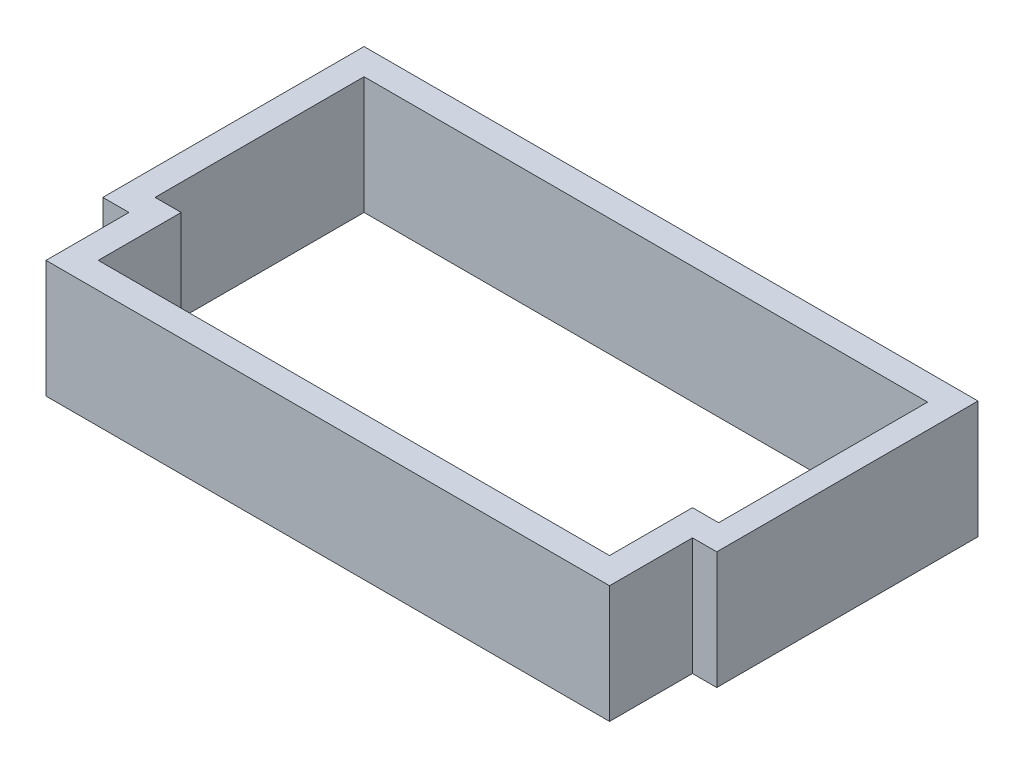
ISO-10303-21;
HEADER;
FILE_DESCRIPTION(('STEP AP214'),'2;1');
FILE_NAME('part.step','',(''),(''),'','','');
FILE_SCHEMA(('AUTOMOTIVE_DESIGN { 1 0 10303 214 1 1 1 1 }'));
ENDSEC;
DATA;
#1=APPLICATION_CONTEXT('core data for automotive mechanical design processes');
#2=APPLICATION_PROTOCOL_DEFINITION('international standard','automotive_design',2000,#1);
#3=PRODUCT_CONTEXT('',#1,'mechanical');
#4=PRODUCT('Part','Part','',(#3));
#5=PRODUCT_RELATED_PRODUCT_CATEGORY('part','',(#4));
#6=PRODUCT_DEFINITION_FORMATION('','',#4);
#7=PRODUCT_DEFINITION_CONTEXT('part definition',#1,'design');
#8=PRODUCT_DEFINITION('design','',#6,#7);
#9=PRODUCT_DEFINITION_SHAPE('','',#8);
#10=(LENGTH_UNIT() NAMED_UNIT(*) SI_UNIT(.MILLI.,.METRE.));
#11=(NAMED_UNIT(*) PLANE_ANGLE_UNIT() SI_UNIT($,.RADIAN.));
#12=(NAMED_UNIT(*) SI_UNIT($,.STERADIAN.) SOLID_ANGLE_UNIT());
#13=UNCERTAINTY_MEASURE_WITH_UNIT(LENGTH_MEASURE(1.E-05),#10,'distance_accuracy_value','');
#14=(GEOMETRIC_REPRESENTATION_CONTEXT(3) GLOBAL_UNCERTAINTY_ASSIGNED_CONTEXT((#13)) GLOBAL_UNIT_ASSIGNED_CONTEXT((#10,
#11,#12)) REPRESENTATION_CONTEXT('',''));
#15=CARTESIAN_POINT('',(0.,0.,0.));
#16=DIRECTION('',(0.,0.,1.));
#17=DIRECTION('',(1.,0.,0.));
#18=AXIS2_PLACEMENT_3D('',#15,#16,#17);
#19=CARTESIAN_POINT('',(0.,4.5,0.));
#20=DIRECTION('',(0.,1.,0.));
#21=DIRECTION('',(0.,0.,1.));
#22=AXIS2_PLACEMENT_3D('',#19,#20,#21);
#23=PLANE('',#22);
#24=DIRECTION('',(-1.,0.,0.));
#25=VECTOR('',#24,1.);
#26=CARTESIAN_POINT('',(11.7144102980499,4.5,-5.));
#27=LINE('',#26,#25);
#28=CARTESIAN_POINT('',(11.7144102980499,4.5,-5.));
#29=VERTEX_POINT('',#28);
#30=CARTESIAN_POINT('',(-11.7855897019501,4.5,-5.));
#31=VERTEX_POINT('',#30);
#32=EDGE_CURVE('E212',#29,#31,#27,.T.);
#33=ORIENTED_EDGE('',*,*,#32,.T.);
#34=DIRECTION('',(0.,0.,1.));
#35=VECTOR('',#34,1.);
#36=CARTESIAN_POINT('',(-11.7855897019501,4.5,-5.));
#37=LINE('',#36,#35);
#38=CARTESIAN_POINT('',(-11.7855897019501,4.5,5.));
#39=VERTEX_POINT('',#38);
#40=EDGE_CURVE('E215',#31,#39,#37,.T.);
#41=ORIENTED_EDGE('',*,*,#40,.T.);
#42=DIRECTION('',(1.,0.,0.));
#43=VECTOR('',#42,1.);
#44=CARTESIAN_POINT('',(-11.7855897019501,4.5,5.));
#45=LINE('',#44,#43);
#46=CARTESIAN_POINT('',(-10.78558970195,4.5,5.));
#47=VERTEX_POINT('',#46);
#48=EDGE_CURVE('E218',#39,#47,#45,.T.);
#49=ORIENTED_EDGE('',*,*,#48,.T.);
#50=DIRECTION('',(0.,0.,1.));
#51=VECTOR('',#50,1.);
#52=CARTESIAN_POINT('',(-10.78558970195,4.5,5.));
#53=LINE('',#52,#51);
#54=CARTESIAN_POINT('',(-10.78558970195,4.5,8.175));
#55=VERTEX_POINT('',#54);
#56=EDGE_CURVE('E220',#47,#55,#53,.T.);
#57=ORIENTED_EDGE('',*,*,#56,.T.);
#58=DIRECTION('',(1.,0.,0.));
#59=VECTOR('',#58,1.);
#60=CARTESIAN_POINT('',(-10.78558970195,4.5,8.175));
#61=LINE('',#60,#59);
#62=CARTESIAN_POINT('',(10.7855897019503,4.5,8.175));
#63=VERTEX_POINT('',#62);
#64=EDGE_CURVE('E222',#55,#63,#61,.T.);
#65=ORIENTED_EDGE('',*,*,#64,.T.);
#66=DIRECTION('',(0.,0.,-1.));
#67=VECTOR('',#66,1.);
#68=CARTESIAN_POINT('',(10.7855897019503,4.5,8.175));
#69=LINE('',#68,#67);
#70=CARTESIAN_POINT('',(10.7855897019503,4.5,5.));
#71=VERTEX_POINT('',#70);
#72=EDGE_CURVE('E224',#63,#71,#69,.T.);
#73=ORIENTED_EDGE('',*,*,#72,.T.);
#74=DIRECTION('',(1.,0.,0.));
#75=VECTOR('',#74,1.);
#76=CARTESIAN_POINT('',(11.7144102980499,4.5,5.));
#77=LINE('',#76,#75);
#78=CARTESIAN_POINT('',(11.7144102980499,4.5,5.));
#79=VERTEX_POINT('',#78);
#80=EDGE_CURVE('E226',#71,#79,#77,.T.);
#81=ORIENTED_EDGE('',*,*,#80,.T.);
#82=DIRECTION('',(0.,0.,-1.));
#83=VECTOR('',#82,1.);
#84=CARTESIAN_POINT('',(11.7144102980499,4.5,-5.));
#85=LINE('',#84,#83);
#86=EDGE_CURVE('E228',#79,#29,#85,.T.);
#87=ORIENTED_EDGE('',*,*,#86,.T.);
#88=EDGE_LOOP('',(#33,#41,#49,#57,#65,#73,#81,#87));
#89=FACE_BOUND('',#88,.T.);
#90=DIRECTION('',(0.,0.,1.));
#91=VECTOR('',#90,1.);
#92=CARTESIAN_POINT('',(-10.7855897019501,4.5,4.));
#93=LINE('',#92,#91);
#94=CARTESIAN_POINT('',(-10.7855897019501,4.5,-4.));
#95=VERTEX_POINT('',#94);
#96=CARTESIAN_POINT('',(-10.7855897019501,4.5,4.));
#97=VERTEX_POINT('',#96);
#98=EDGE_CURVE('E155',#95,#97,#93,.T.);
#99=ORIENTED_EDGE('',*,*,#98,.F.);
#100=DIRECTION('',(-1.,0.,0.));
#101=VECTOR('',#100,1.);
#102=CARTESIAN_POINT('',(-10.7855897019501,4.5,-4.));
#103=LINE('',#102,#101);
#104=CARTESIAN_POINT('',(10.7855897019501,4.5,-4.));
#105=VERTEX_POINT('',#104);
#106=EDGE_CURVE('E147',#105,#95,#103,.T.);
#107=ORIENTED_EDGE('',*,*,#106,.F.);
#108=DIRECTION('',(0.,0.,-1.));
#109=VECTOR('',#108,1.);
#110=CARTESIAN_POINT('',(10.7855897019501,4.5,-4.));
#111=LINE('',#110,#109);
#112=CARTESIAN_POINT('',(10.7855897019501,4.5,4.));
#113=VERTEX_POINT('',#112);
#114=EDGE_CURVE('E180',#113,#105,#111,.T.);
#115=ORIENTED_EDGE('',*,*,#114,.F.);
#116=DIRECTION('',(1.,0.,0.));
#117=VECTOR('',#116,1.);
#118=CARTESIAN_POINT('',(10.7855897019501,4.5,4.));
#119=LINE('',#118,#117);
#120=CARTESIAN_POINT('',(9.78558970195033,4.5,4.));
#121=VERTEX_POINT('',#120);
#122=EDGE_CURVE('E178',#121,#113,#119,.T.);
#123=ORIENTED_EDGE('',*,*,#122,.F.);
#124=DIRECTION('',(0.,0.,-1.));
#125=VECTOR('',#124,1.);
#126=CARTESIAN_POINT('',(9.78558970195033,4.5,4.));
#127=LINE('',#126,#125);
#128=CARTESIAN_POINT('',(9.78558970195033,4.5,7.175));
#129=VERTEX_POINT('',#128);
#130=EDGE_CURVE('E176',#129,#121,#127,.T.);
#131=ORIENTED_EDGE('',*,*,#130,.F.);
#132=DIRECTION('',(1.,0.,0.));
#133=VECTOR('',#132,1.);
#134=CARTESIAN_POINT('',(-9.78558970194998,4.5,7.175));
#135=LINE('',#134,#133);
#136=CARTESIAN_POINT('',(-9.78558970194998,4.5,7.175));
#137=VERTEX_POINT('',#136);
#138=EDGE_CURVE('E174',#137,#129,#135,.T.);
#139=ORIENTED_EDGE('',*,*,#138,.F.);
#140=DIRECTION('',(0.,0.,1.));
#141=VECTOR('',#140,1.);
#142=CARTESIAN_POINT('',(-9.78558970194998,4.5,4.));
#143=LINE('',#142,#141);
#144=CARTESIAN_POINT('',(-9.78558970194998,4.5,4.));
#145=VERTEX_POINT('',#144);
#146=EDGE_CURVE('E170',#145,#137,#143,.T.);
#147=ORIENTED_EDGE('',*,*,#146,.F.);
#148=DIRECTION('',(1.,0.,0.));
#149=VECTOR('',#148,1.);
#150=CARTESIAN_POINT('',(-9.78558970194998,4.5,4.));
#151=LINE('',#150,#149);
#152=EDGE_CURVE('E168',#97,#145,#151,.T.);
#153=ORIENTED_EDGE('',*,*,#152,.F.);
#154=EDGE_LOOP('',(#99,#107,#115,#123,#131,#139,#147,#153));
#155=FACE_BOUND('',#154,.T.);
#156=ADVANCED_FACE('F34',(#89,#155),#23,.T.);
#157=CARTESIAN_POINT('',(0.,0.,0.));
#158=DIRECTION('',(0.,1.,0.));
#159=DIRECTION('',(0.,0.,1.));
#160=AXIS2_PLACEMENT_3D('',#157,#158,#159);
#161=PLANE('',#160);
#162=DIRECTION('',(-1.,0.,0.));
#163=VECTOR('',#162,1.);
#164=CARTESIAN_POINT('',(11.7144102980499,0.,-5.));
#165=LINE('',#164,#163);
#166=CARTESIAN_POINT('',(11.7144102980499,0.,-5.));
#167=VERTEX_POINT('',#166);
#168=CARTESIAN_POINT('',(-11.7855897019501,0.,-5.));
#169=VERTEX_POINT('',#168);
#170=EDGE_CURVE('E163',#167,#169,#165,.T.);
#171=ORIENTED_EDGE('',*,*,#170,.F.);
#172=DIRECTION('',(0.,0.,-1.));
#173=VECTOR('',#172,1.);
#174=CARTESIAN_POINT('',(11.7144102980499,0.,-5.));
#175=LINE('',#174,#173);
#176=CARTESIAN_POINT('',(11.7144102980499,0.,5.));
#177=VERTEX_POINT('',#176);
#178=EDGE_CURVE('E216',#177,#167,#175,.T.);
#179=ORIENTED_EDGE('',*,*,#178,.F.);
#180=DIRECTION('',(1.,0.,0.));
#181=VECTOR('',#180,1.);
#182=CARTESIAN_POINT('',(11.7144102980499,0.,5.));
#183=LINE('',#182,#181);
#184=CARTESIAN_POINT('',(10.7855897019503,0.,5.));
#185=VERTEX_POINT('',#184);
#186=EDGE_CURVE('E243',#185,#177,#183,.T.);
#187=ORIENTED_EDGE('',*,*,#186,.F.);
#188=DIRECTION('',(0.,0.,-1.));
#189=VECTOR('',#188,1.);
#190=CARTESIAN_POINT('',(10.7855897019503,0.,8.175));
#191=LINE('',#190,#189);
#192=CARTESIAN_POINT('',(10.7855897019503,0.,8.175));
#193=VERTEX_POINT('',#192);
#194=EDGE_CURVE('E241',#193,#185,#191,.T.);
#195=ORIENTED_EDGE('',*,*,#194,.F.);
#196=DIRECTION('',(1.,0.,0.));
#197=VECTOR('',#196,1.);
#198=CARTESIAN_POINT('',(-10.78558970195,0.,8.175));
#199=LINE('',#198,#197);
#200=CARTESIAN_POINT('',(-10.78558970195,0.,8.175));
#201=VERTEX_POINT('',#200);
#202=EDGE_CURVE('E239',#201,#193,#199,.T.);
#203=ORIENTED_EDGE('',*,*,#202,.F.);
#204=DIRECTION('',(0.,0.,1.));
#205=VECTOR('',#204,1.);
#206=CARTESIAN_POINT('',(-10.78558970195,0.,5.));
#207=LINE('',#206,#205);
#208=CARTESIAN_POINT('',(-10.78558970195,0.,5.));
#209=VERTEX_POINT('',#208);
#210=EDGE_CURVE('E237',#209,#201,#207,.T.);
#211=ORIENTED_EDGE('',*,*,#210,.F.);
#212=DIRECTION('',(1.,0.,0.));
#213=VECTOR('',#212,1.);
#214=CARTESIAN_POINT('',(-11.7855897019501,0.,5.));
#215=LINE('',#214,#213);
#216=CARTESIAN_POINT('',(-11.7855897019501,0.,5.));
#217=VERTEX_POINT('',#216);
#218=EDGE_CURVE('E235',#217,#209,#215,.T.);
#219=ORIENTED_EDGE('',*,*,#218,.F.);
#220=DIRECTION('',(0.,0.,1.));
#221=VECTOR('',#220,1.);
#222=CARTESIAN_POINT('',(-11.7855897019501,0.,-5.));
#223=LINE('',#222,#221);
#224=EDGE_CURVE('E233',#169,#217,#223,.T.);
#225=ORIENTED_EDGE('',*,*,#224,.F.);
#226=EDGE_LOOP('',(#171,#179,#187,#195,#203,#211,#219,#225));
#227=FACE_BOUND('',#226,.T.);
#228=DIRECTION('',(-1.,0.,0.));
#229=VECTOR('',#228,1.);
#230=CARTESIAN_POINT('',(-10.7855897019501,0.,-4.));
#231=LINE('',#230,#229);
#232=CARTESIAN_POINT('',(10.7855897019501,0.,-4.));
#233=VERTEX_POINT('',#232);
#234=CARTESIAN_POINT('',(-10.7855897019501,0.,-4.));
#235=VERTEX_POINT('',#234);
#236=EDGE_CURVE('E57',#233,#235,#231,.T.);
#237=ORIENTED_EDGE('',*,*,#236,.T.);
#238=DIRECTION('',(0.,0.,1.));
#239=VECTOR('',#238,1.);
#240=CARTESIAN_POINT('',(-10.7855897019501,0.,4.));
#241=LINE('',#240,#239);
#242=CARTESIAN_POINT('',(-10.7855897019501,0.,4.));
#243=VERTEX_POINT('',#242);
#244=EDGE_CURVE('E162',#235,#243,#241,.T.);
#245=ORIENTED_EDGE('',*,*,#244,.T.);
#246=DIRECTION('',(1.,0.,0.));
#247=VECTOR('',#246,1.);
#248=CARTESIAN_POINT('',(-9.78558970194998,0.,4.));
#249=LINE('',#248,#247);
#250=CARTESIAN_POINT('',(-9.78558970194998,0.,4.));
#251=VERTEX_POINT('',#250);
#252=EDGE_CURVE('E184',#243,#251,#249,.T.);
#253=ORIENTED_EDGE('',*,*,#252,.T.);
#254=DIRECTION('',(0.,0.,1.));
#255=VECTOR('',#254,1.);
#256=CARTESIAN_POINT('',(-9.78558970194998,0.,4.));
#257=LINE('',#256,#255);
#258=CARTESIAN_POINT('',(-9.78558970194998,0.,7.175));
#259=VERTEX_POINT('',#258);
#260=EDGE_CURVE('E187',#251,#259,#257,.T.);
#261=ORIENTED_EDGE('',*,*,#260,.T.);
#262=DIRECTION('',(1.,0.,0.));
#263=VECTOR('',#262,1.);
#264=CARTESIAN_POINT('',(-9.78558970194998,0.,7.175));
#265=LINE('',#264,#263);
#266=CARTESIAN_POINT('',(9.78558970195033,0.,7.175));
#267=VERTEX_POINT('',#266);
#268=EDGE_CURVE('E190',#259,#267,#265,.T.);
#269=ORIENTED_EDGE('',*,*,#268,.T.);
#270=DIRECTION('',(0.,0.,-1.));
#271=VECTOR('',#270,1.);
#272=CARTESIAN_POINT('',(9.78558970195033,0.,4.));
#273=LINE('',#272,#271);
#274=CARTESIAN_POINT('',(9.78558970195033,0.,4.));
#275=VERTEX_POINT('',#274);
#276=EDGE_CURVE('E193',#267,#275,#273,.T.);
#277=ORIENTED_EDGE('',*,*,#276,.T.);
#278=DIRECTION('',(1.,0.,0.));
#279=VECTOR('',#278,1.);
#280=CARTESIAN_POINT('',(10.7855897019501,0.,4.));
#281=LINE('',#280,#279);
#282=CARTESIAN_POINT('',(10.7855897019501,0.,4.));
#283=VERTEX_POINT('',#282);
#284=EDGE_CURVE('E196',#275,#283,#281,.T.);
#285=ORIENTED_EDGE('',*,*,#284,.T.);
#286=DIRECTION('',(0.,0.,-1.));
#287=VECTOR('',#286,1.);
#288=CARTESIAN_POINT('',(10.7855897019501,0.,-4.));
#289=LINE('',#288,#287);
#290=EDGE_CURVE('E156',#283,#233,#289,.T.);
#291=ORIENTED_EDGE('',*,*,#290,.T.);
#292=EDGE_LOOP('',(#237,#245,#253,#261,#269,#277,#285,#291));
#293=FACE_BOUND('',#292,.T.);
#294=ADVANCED_FACE('F273',(#227,#293),#161,.F.);
#295=CARTESIAN_POINT('',(11.7144102980499,4.5,-5.));
#296=DIRECTION('',(0.,0.,1.));
#297=DIRECTION('',(1.,0.,0.));
#298=AXIS2_PLACEMENT_3D('',#295,#296,#297);
#299=PLANE('',#298);
#300=ORIENTED_EDGE('',*,*,#170,.T.);
#301=DIRECTION('',(0.,-1.,0.));
#302=VECTOR('',#301,1.);
#303=CARTESIAN_POINT('',(-11.7855897019501,4.5,-5.));
#304=LINE('',#303,#302);
#305=EDGE_CURVE('E11',#31,#169,#304,.T.);
#306=ORIENTED_EDGE('',*,*,#305,.F.);
#307=ORIENTED_EDGE('',*,*,#32,.F.);
#308=DIRECTION('',(0.,-1.,0.));
#309=VECTOR('',#308,1.);
#310=CARTESIAN_POINT('',(11.7144102980499,4.5,-5.));
#311=LINE('',#310,#309);
#312=EDGE_CURVE('E230',#29,#167,#311,.T.);
#313=ORIENTED_EDGE('',*,*,#312,.T.);
#314=EDGE_LOOP('',(#300,#306,#307,#313));
#315=FACE_BOUND('',#314,.T.);
#316=ADVANCED_FACE('F36',(#315),#299,.F.);
#317=CARTESIAN_POINT('',(-11.7855897019501,4.5,-5.));
#318=DIRECTION('',(1.,0.,0.));
#319=DIRECTION('',(0.,0.,-1.));
#320=AXIS2_PLACEMENT_3D('',#317,#318,#319);
#321=PLANE('',#320);
#322=ORIENTED_EDGE('',*,*,#224,.T.);
#323=DIRECTION('',(0.,-1.,0.));
#324=VECTOR('',#323,1.);
#325=CARTESIAN_POINT('',(-11.7855897019501,4.5,5.));
#326=LINE('',#325,#324);
#327=EDGE_CURVE('E42',#39,#217,#326,.T.);
#328=ORIENTED_EDGE('',*,*,#327,.F.);
#329=ORIENTED_EDGE('',*,*,#40,.F.);
#330=ORIENTED_EDGE('',*,*,#305,.T.);
#331=EDGE_LOOP('',(#322,#328,#329,#330));
#332=FACE_BOUND('',#331,.T.);
#333=ADVANCED_FACE('F290',(#332),#321,.F.);
#334=CARTESIAN_POINT('',(-11.7855897019501,4.5,5.));
#335=DIRECTION('',(0.,0.,-1.));
#336=DIRECTION('',(-1.,0.,0.));
#337=AXIS2_PLACEMENT_3D('',#334,#335,#336);
#338=PLANE('',#337);
#339=ORIENTED_EDGE('',*,*,#218,.T.);
#340=DIRECTION('',(0.,-1.,0.));
#341=VECTOR('',#340,1.);
#342=CARTESIAN_POINT('',(-10.78558970195,4.5,5.));
#343=LINE('',#342,#341);
#344=EDGE_CURVE('E260',#47,#209,#343,.T.);
#345=ORIENTED_EDGE('',*,*,#344,.F.);
#346=ORIENTED_EDGE('',*,*,#48,.F.);
#347=ORIENTED_EDGE('',*,*,#327,.T.);
#348=EDGE_LOOP('',(#339,#345,#346,#347));
#349=FACE_BOUND('',#348,.T.);
#350=ADVANCED_FACE('F267',(#349),#338,.F.);
#351=CARTESIAN_POINT('',(-10.78558970195,4.5,5.));
#352=DIRECTION('',(1.,0.,0.));
#353=DIRECTION('',(0.,0.,-1.));
#354=AXIS2_PLACEMENT_3D('',#351,#352,#353);
#355=PLANE('',#354);
#356=ORIENTED_EDGE('',*,*,#210,.T.);
#357=DIRECTION('',(0.,-1.,0.));
#358=VECTOR('',#357,1.);
#359=CARTESIAN_POINT('',(-10.78558970195,4.5,8.175));
#360=LINE('',#359,#358);
#361=EDGE_CURVE('E257',#55,#201,#360,.T.);
#362=ORIENTED_EDGE('',*,*,#361,.F.);
#363=ORIENTED_EDGE('',*,*,#56,.F.);
#364=ORIENTED_EDGE('',*,*,#344,.T.);
#365=EDGE_LOOP('',(#356,#362,#363,#364));
#366=FACE_BOUND('',#365,.T.);
#367=ADVANCED_FACE('F279',(#366),#355,.F.);
#368=CARTESIAN_POINT('',(-10.78558970195,4.5,8.175));
#369=DIRECTION('',(0.,0.,-1.));
#370=DIRECTION('',(-1.,0.,0.));
#371=AXIS2_PLACEMENT_3D('',#368,#369,#370);
#372=PLANE('',#371);
#373=ORIENTED_EDGE('',*,*,#202,.T.);
#374=DIRECTION('',(0.,-1.,0.));
#375=VECTOR('',#374,1.);
#376=CARTESIAN_POINT('',(10.7855897019503,4.5,8.175));
#377=LINE('',#376,#375);
#378=EDGE_CURVE('E254',#63,#193,#377,.T.);
#379=ORIENTED_EDGE('',*,*,#378,.F.);
#380=ORIENTED_EDGE('',*,*,#64,.F.);
#381=ORIENTED_EDGE('',*,*,#361,.T.);
#382=EDGE_LOOP('',(#373,#379,#380,#381));
#383=FACE_BOUND('',#382,.T.);
#384=ADVANCED_FACE('F283',(#383),#372,.F.);
#385=CARTESIAN_POINT('',(10.7855897019503,4.5,8.175));
#386=DIRECTION('',(-1.,0.,0.));
#387=DIRECTION('',(0.,0.,1.));
#388=AXIS2_PLACEMENT_3D('',#385,#386,#387);
#389=PLANE('',#388);
#390=ORIENTED_EDGE('',*,*,#194,.T.);
#391=DIRECTION('',(0.,-1.,0.));
#392=VECTOR('',#391,1.);
#393=CARTESIAN_POINT('',(10.7855897019503,4.5,5.));
#394=LINE('',#393,#392);
#395=EDGE_CURVE('E251',#71,#185,#394,.T.);
#396=ORIENTED_EDGE('',*,*,#395,.F.);
#397=ORIENTED_EDGE('',*,*,#72,.F.);
#398=ORIENTED_EDGE('',*,*,#378,.T.);
#399=EDGE_LOOP('',(#390,#396,#397,#398));
#400=FACE_BOUND('',#399,.T.);
#401=ADVANCED_FACE('F303',(#400),#389,.F.);
#402=CARTESIAN_POINT('',(11.7144102980499,4.5,5.));
#403=DIRECTION('',(0.,0.,-1.));
#404=DIRECTION('',(-1.,0.,0.));
#405=AXIS2_PLACEMENT_3D('',#402,#403,#404);
#406=PLANE('',#405);
#407=ORIENTED_EDGE('',*,*,#186,.T.);
#408=DIRECTION('',(0.,-1.,0.));
#409=VECTOR('',#408,1.);
#410=CARTESIAN_POINT('',(11.7144102980499,4.5,5.));
#411=LINE('',#410,#409);
#412=EDGE_CURVE('E248',#79,#177,#411,.T.);
#413=ORIENTED_EDGE('',*,*,#412,.F.);
#414=ORIENTED_EDGE('',*,*,#80,.F.);
#415=ORIENTED_EDGE('',*,*,#395,.T.);
#416=EDGE_LOOP('',(#407,#413,#414,#415));
#417=FACE_BOUND('',#416,.T.);
#418=ADVANCED_FACE('F301',(#417),#406,.F.);
#419=CARTESIAN_POINT('',(11.7144102980499,4.5,-5.));
#420=DIRECTION('',(-1.,0.,0.));
#421=DIRECTION('',(0.,0.,1.));
#422=AXIS2_PLACEMENT_3D('',#419,#420,#421);
#423=PLANE('',#422);
#424=ORIENTED_EDGE('',*,*,#178,.T.);
#425=ORIENTED_EDGE('',*,*,#312,.F.);
#426=ORIENTED_EDGE('',*,*,#86,.F.);
#427=ORIENTED_EDGE('',*,*,#412,.T.);
#428=EDGE_LOOP('',(#424,#425,#426,#427));
#429=FACE_BOUND('',#428,.T.);
#430=ADVANCED_FACE('F296',(#429),#423,.F.);
#431=CARTESIAN_POINT('',(-10.7855897019501,4.5,-4.));
#432=DIRECTION('',(0.,0.,1.));
#433=DIRECTION('',(1.,0.,0.));
#434=AXIS2_PLACEMENT_3D('',#431,#432,#433);
#435=PLANE('',#434);
#436=ORIENTED_EDGE('',*,*,#236,.F.);
#437=DIRECTION('',(0.,-1.,0.));
#438=VECTOR('',#437,1.);
#439=CARTESIAN_POINT('',(10.7855897019501,4.5,-4.));
#440=LINE('',#439,#438);
#441=EDGE_CURVE('E151',#105,#233,#440,.T.);
#442=ORIENTED_EDGE('',*,*,#441,.F.);
#443=ORIENTED_EDGE('',*,*,#106,.T.);
#444=DIRECTION('',(0.,-1.,0.));
#445=VECTOR('',#444,1.);
#446=CARTESIAN_POINT('',(-10.7855897019501,4.5,-4.));
#447=LINE('',#446,#445);
#448=EDGE_CURVE('E150',#95,#235,#447,.T.);
#449=ORIENTED_EDGE('',*,*,#448,.T.);
#450=EDGE_LOOP('',(#436,#442,#443,#449));
#451=FACE_BOUND('',#450,.T.);
#452=ADVANCED_FACE('F149',(#451),#435,.T.);
#453=CARTESIAN_POINT('',(-10.7855897019501,4.5,4.));
#454=DIRECTION('',(1.,0.,0.));
#455=DIRECTION('',(0.,0.,-1.));
#456=AXIS2_PLACEMENT_3D('',#453,#454,#455);
#457=PLANE('',#456);
#458=ORIENTED_EDGE('',*,*,#244,.F.);
#459=ORIENTED_EDGE('',*,*,#448,.F.);
#460=ORIENTED_EDGE('',*,*,#98,.T.);
#461=DIRECTION('',(0.,-1.,0.));
#462=VECTOR('',#461,1.);
#463=CARTESIAN_POINT('',(-10.7855897019501,4.5,4.));
#464=LINE('',#463,#462);
#465=EDGE_CURVE('E164',#97,#243,#464,.T.);
#466=ORIENTED_EDGE('',*,*,#465,.T.);
#467=EDGE_LOOP('',(#458,#459,#460,#466));
#468=FACE_BOUND('',#467,.T.);
#469=ADVANCED_FACE('F159',(#468),#457,.T.);
#470=CARTESIAN_POINT('',(-9.78558970194998,4.5,4.));
#471=DIRECTION('',(0.,0.,-1.));
#472=DIRECTION('',(-1.,0.,0.));
#473=AXIS2_PLACEMENT_3D('',#470,#471,#472);
#474=PLANE('',#473);
#475=ORIENTED_EDGE('',*,*,#252,.F.);
#476=ORIENTED_EDGE('',*,*,#465,.F.);
#477=ORIENTED_EDGE('',*,*,#152,.T.);
#478=DIRECTION('',(0.,-1.,0.));
#479=VECTOR('',#478,1.);
#480=CARTESIAN_POINT('',(-9.78558970194998,4.5,4.));
#481=LINE('',#480,#479);
#482=EDGE_CURVE('E209',#145,#251,#481,.T.);
#483=ORIENTED_EDGE('',*,*,#482,.T.);
#484=EDGE_LOOP('',(#475,#476,#477,#483));
#485=FACE_BOUND('',#484,.T.);
#486=ADVANCED_FACE('F328',(#485),#474,.T.);
#487=CARTESIAN_POINT('',(-9.78558970194998,4.5,4.));
#488=DIRECTION('',(1.,0.,0.));
#489=DIRECTION('',(0.,0.,-1.));
#490=AXIS2_PLACEMENT_3D('',#487,#488,#489);
#491=PLANE('',#490);
#492=ORIENTED_EDGE('',*,*,#260,.F.);
#493=ORIENTED_EDGE('',*,*,#482,.F.);
#494=ORIENTED_EDGE('',*,*,#146,.T.);
#495=DIRECTION('',(0.,-1.,0.));
#496=VECTOR('',#495,1.);
#497=CARTESIAN_POINT('',(-9.78558970194998,4.5,7.175));
#498=LINE('',#497,#496);
#499=EDGE_CURVE('E207',#137,#259,#498,.T.);
#500=ORIENTED_EDGE('',*,*,#499,.T.);
#501=EDGE_LOOP('',(#492,#493,#494,#500));
#502=FACE_BOUND('',#501,.T.);
#503=ADVANCED_FACE('F332',(#502),#491,.T.);
#504=CARTESIAN_POINT('',(-9.78558970194998,4.5,7.175));
#505=DIRECTION('',(0.,0.,-1.));
#506=DIRECTION('',(-1.,0.,0.));
#507=AXIS2_PLACEMENT_3D('',#504,#505,#506);
#508=PLANE('',#507);
#509=ORIENTED_EDGE('',*,*,#268,.F.);
#510=ORIENTED_EDGE('',*,*,#499,.F.);
#511=ORIENTED_EDGE('',*,*,#138,.T.);
#512=DIRECTION('',(0.,-1.,0.));
#513=VECTOR('',#512,1.);
#514=CARTESIAN_POINT('',(9.78558970195033,4.5,7.175));
#515=LINE('',#514,#513);
#516=EDGE_CURVE('E205',#129,#267,#515,.T.);
#517=ORIENTED_EDGE('',*,*,#516,.T.);
#518=EDGE_LOOP('',(#509,#510,#511,#517));
#519=FACE_BOUND('',#518,.T.);
#520=ADVANCED_FACE('F338',(#519),#508,.T.);
#521=CARTESIAN_POINT('',(9.78558970195033,4.5,4.));
#522=DIRECTION('',(-1.,0.,0.));
#523=DIRECTION('',(0.,0.,1.));
#524=AXIS2_PLACEMENT_3D('',#521,#522,#523);
#525=PLANE('',#524);
#526=ORIENTED_EDGE('',*,*,#276,.F.);
#527=ORIENTED_EDGE('',*,*,#516,.F.);
#528=ORIENTED_EDGE('',*,*,#130,.T.);
#529=DIRECTION('',(0.,-1.,0.));
#530=VECTOR('',#529,1.);
#531=CARTESIAN_POINT('',(9.78558970195033,4.5,4.));
#532=LINE('',#531,#530);
#533=EDGE_CURVE('E203',#121,#275,#532,.T.);
#534=ORIENTED_EDGE('',*,*,#533,.T.);
#535=EDGE_LOOP('',(#526,#527,#528,#534));
#536=FACE_BOUND('',#535,.T.);
#537=ADVANCED_FACE('F342',(#536),#525,.T.);
#538=CARTESIAN_POINT('',(10.7855897019501,4.5,4.));
#539=DIRECTION('',(0.,0.,-1.));
#540=DIRECTION('',(-1.,0.,0.));
#541=AXIS2_PLACEMENT_3D('',#538,#539,#540);
#542=PLANE('',#541);
#543=ORIENTED_EDGE('',*,*,#284,.F.);
#544=ORIENTED_EDGE('',*,*,#533,.F.);
#545=ORIENTED_EDGE('',*,*,#122,.T.);
#546=DIRECTION('',(0.,-1.,0.));
#547=VECTOR('',#546,1.);
#548=CARTESIAN_POINT('',(10.7855897019501,4.5,4.));
#549=LINE('',#548,#547);
#550=EDGE_CURVE('E49',#113,#283,#549,.T.);
#551=ORIENTED_EDGE('',*,*,#550,.T.);
#552=EDGE_LOOP('',(#543,#544,#545,#551));
#553=FACE_BOUND('',#552,.T.);
#554=ADVANCED_FACE('F346',(#553),#542,.T.);
#555=CARTESIAN_POINT('',(10.7855897019501,4.5,-4.));
#556=DIRECTION('',(-1.,0.,0.));
#557=DIRECTION('',(0.,0.,1.));
#558=AXIS2_PLACEMENT_3D('',#555,#556,#557);
#559=PLANE('',#558);
#560=ORIENTED_EDGE('',*,*,#290,.F.);
#561=ORIENTED_EDGE('',*,*,#550,.F.);
#562=ORIENTED_EDGE('',*,*,#114,.T.);
#563=ORIENTED_EDGE('',*,*,#441,.T.);
#564=EDGE_LOOP('',(#560,#561,#562,#563));
#565=FACE_BOUND('',#564,.T.);
#566=ADVANCED_FACE('F350',(#565),#559,.T.);
#567=CLOSED_SHELL('',(#156,#294,#316,#333,#350,#367,#384,#401,#418,#430,#452,#469,#486,#503,
#520,#537,#554,#566));
#568=MANIFOLD_SOLID_BREP('B2',#567);
#569=ADVANCED_BREP_SHAPE_REPRESENTATION('',(#18,#568),#14);
#570=SHAPE_DEFINITION_REPRESENTATION(#9,#569);
ENDSEC;
END-ISO-10303-21;
